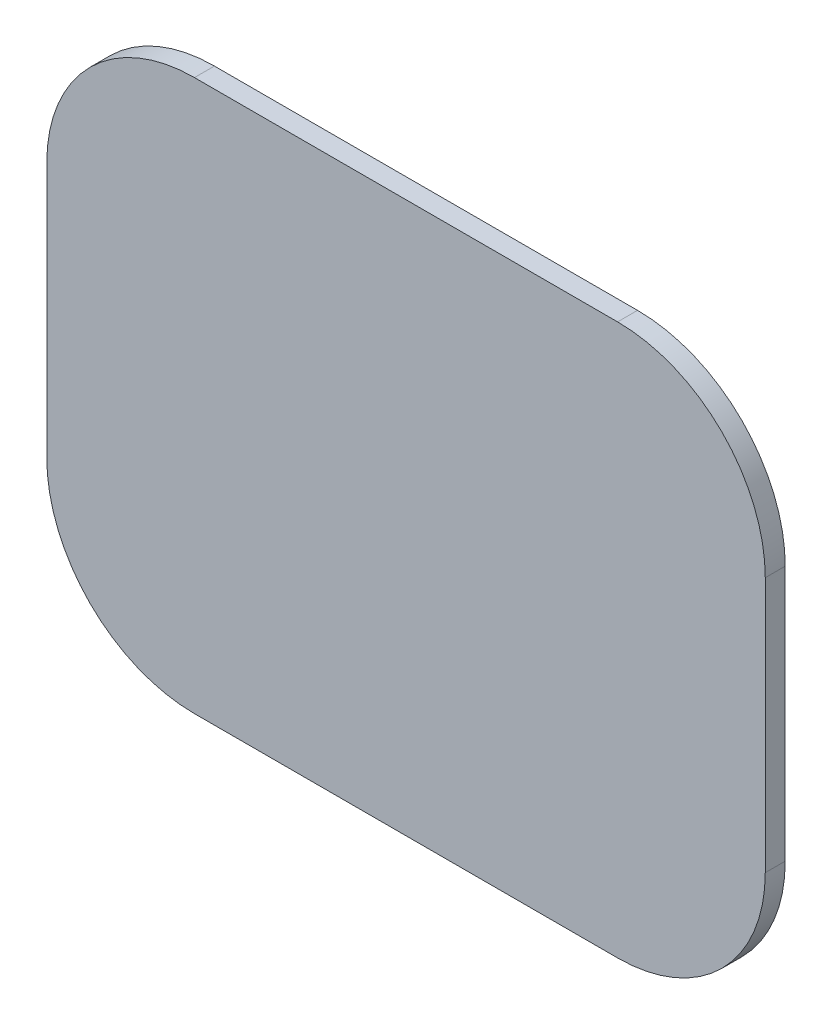
ISO-10303-21;
HEADER;
FILE_DESCRIPTION(('STEP AP214'),'2;1');
FILE_NAME('part.step','',(''),(''),'','','');
FILE_SCHEMA(('AUTOMOTIVE_DESIGN { 1 0 10303 214 1 1 1 1 }'));
ENDSEC;
DATA;
#1=APPLICATION_CONTEXT('core data for automotive mechanical design processes');
#2=APPLICATION_PROTOCOL_DEFINITION('international standard','automotive_design',2000,#1);
#3=PRODUCT_CONTEXT('',#1,'mechanical');
#4=PRODUCT('Part','Part','',(#3));
#5=PRODUCT_RELATED_PRODUCT_CATEGORY('part','',(#4));
#6=PRODUCT_DEFINITION_FORMATION('','',#4);
#7=PRODUCT_DEFINITION_CONTEXT('part definition',#1,'design');
#8=PRODUCT_DEFINITION('design','',#6,#7);
#9=PRODUCT_DEFINITION_SHAPE('','',#8);
#10=(LENGTH_UNIT() NAMED_UNIT(*) SI_UNIT(.MILLI.,.METRE.));
#11=(NAMED_UNIT(*) PLANE_ANGLE_UNIT() SI_UNIT($,.RADIAN.));
#12=(NAMED_UNIT(*) SI_UNIT($,.STERADIAN.) SOLID_ANGLE_UNIT());
#13=UNCERTAINTY_MEASURE_WITH_UNIT(LENGTH_MEASURE(1.E-05),#10,'distance_accuracy_value','');
#14=(GEOMETRIC_REPRESENTATION_CONTEXT(3) GLOBAL_UNCERTAINTY_ASSIGNED_CONTEXT((#13)) GLOBAL_UNIT_ASSIGNED_CONTEXT((#10,
#11,#12)) REPRESENTATION_CONTEXT('',''));
#15=CARTESIAN_POINT('',(0.,0.,0.));
#16=DIRECTION('',(0.,0.,1.));
#17=DIRECTION('',(1.,0.,0.));
#18=AXIS2_PLACEMENT_3D('',#15,#16,#17);
#19=CARTESIAN_POINT('',(144.480934022152,693.750628573082,9.50000000000003));
#20=DIRECTION('',(0.,0.,-1.));
#21=DIRECTION('',(-1.,0.,0.));
#22=AXIS2_PLACEMENT_3D('',#19,#20,#21);
#23=CYLINDRICAL_SURFACE('',#22,18.5);
#24=CARTESIAN_POINT('',(144.480934022152,693.750628573082,7.00000000000002));
#25=DIRECTION('',(0.,0.,1.));
#26=DIRECTION('',(1.,0.,0.));
#27=AXIS2_PLACEMENT_3D('',#24,#25,#26);
#28=CIRCLE('',#27,18.5);
#29=CARTESIAN_POINT('',(144.480934022153,712.250628573082,7.00000000000002));
#30=VERTEX_POINT('',#29);
#31=CARTESIAN_POINT('',(125.980934022152,693.750628573082,7.00000000000002));
#32=VERTEX_POINT('',#31);
#33=EDGE_CURVE('E129',#30,#32,#28,.T.);
#34=ORIENTED_EDGE('',*,*,#33,.T.);
#35=DIRECTION('',(0.,0.,-1.));
#36=VECTOR('',#35,1.);
#37=CARTESIAN_POINT('',(125.980934022152,693.750628573082,9.50000000000003));
#38=LINE('',#37,#36);
#39=CARTESIAN_POINT('',(125.980934022152,693.750628573082,9.50000000000003));
#40=VERTEX_POINT('',#39);
#41=EDGE_CURVE('E11',#40,#32,#38,.T.);
#42=ORIENTED_EDGE('',*,*,#41,.F.);
#43=CARTESIAN_POINT('',(144.480934022152,693.750628573082,9.50000000000003));
#44=DIRECTION('',(0.,0.,1.));
#45=DIRECTION('',(1.,0.,0.));
#46=AXIS2_PLACEMENT_3D('',#43,#44,#45);
#47=CIRCLE('',#46,18.5);
#48=CARTESIAN_POINT('',(144.480934022153,712.250628573082,9.50000000000003));
#49=VERTEX_POINT('',#48);
#50=EDGE_CURVE('E143',#49,#40,#47,.T.);
#51=ORIENTED_EDGE('',*,*,#50,.F.);
#52=DIRECTION('',(0.,0.,-1.));
#53=VECTOR('',#52,1.);
#54=CARTESIAN_POINT('',(144.480934022153,712.250628573082,9.50000000000003));
#55=LINE('',#54,#53);
#56=EDGE_CURVE('E125',#49,#30,#55,.T.);
#57=ORIENTED_EDGE('',*,*,#56,.T.);
#58=EDGE_LOOP('',(#34,#42,#51,#57));
#59=FACE_BOUND('',#58,.T.);
#60=ADVANCED_FACE('F33',(#59),#23,.T.);
#61=CARTESIAN_POINT('',(125.980934022152,693.750628573082,9.50000000000003));
#62=DIRECTION('',(1.,0.,0.));
#63=DIRECTION('',(0.,0.,-1.));
#64=AXIS2_PLACEMENT_3D('',#61,#62,#63);
#65=PLANE('',#64);
#66=DIRECTION('',(0.,-1.,0.));
#67=VECTOR('',#66,1.);
#68=CARTESIAN_POINT('',(125.980934022152,693.750628573082,7.00000000000002));
#69=LINE('',#68,#67);
#70=CARTESIAN_POINT('',(125.980934022152,661.750628573082,7.00000000000002));
#71=VERTEX_POINT('',#70);
#72=EDGE_CURVE('E132',#32,#71,#69,.T.);
#73=ORIENTED_EDGE('',*,*,#72,.T.);
#74=DIRECTION('',(0.,0.,-1.));
#75=VECTOR('',#74,1.);
#76=CARTESIAN_POINT('',(125.980934022152,661.750628573082,9.50000000000003));
#77=LINE('',#76,#75);
#78=CARTESIAN_POINT('',(125.980934022152,661.750628573082,9.50000000000003));
#79=VERTEX_POINT('',#78);
#80=EDGE_CURVE('E41',#79,#71,#77,.T.);
#81=ORIENTED_EDGE('',*,*,#80,.F.);
#82=DIRECTION('',(0.,-1.,0.));
#83=VECTOR('',#82,1.);
#84=CARTESIAN_POINT('',(125.980934022152,693.750628573082,9.50000000000003));
#85=LINE('',#84,#83);
#86=EDGE_CURVE('E92',#40,#79,#85,.T.);
#87=ORIENTED_EDGE('',*,*,#86,.F.);
#88=ORIENTED_EDGE('',*,*,#41,.T.);
#89=EDGE_LOOP('',(#73,#81,#87,#88));
#90=FACE_BOUND('',#89,.T.);
#91=ADVANCED_FACE('F178',(#90),#65,.F.);
#92=CARTESIAN_POINT('',(144.480934022152,661.750628573082,9.50000000000003));
#93=DIRECTION('',(0.,0.,-1.));
#94=DIRECTION('',(-1.,0.,0.));
#95=AXIS2_PLACEMENT_3D('',#92,#93,#94);
#96=CYLINDRICAL_SURFACE('',#95,18.5);
#97=CARTESIAN_POINT('',(144.480934022152,661.750628573082,7.00000000000002));
#98=DIRECTION('',(0.,0.,1.));
#99=DIRECTION('',(1.,0.,0.));
#100=AXIS2_PLACEMENT_3D('',#97,#98,#99);
#101=CIRCLE('',#100,18.5);
#102=CARTESIAN_POINT('',(144.480934022153,643.250628573082,7.00000000000002));
#103=VERTEX_POINT('',#102);
#104=EDGE_CURVE('E134',#71,#103,#101,.T.);
#105=ORIENTED_EDGE('',*,*,#104,.T.);
#106=DIRECTION('',(0.,0.,-1.));
#107=VECTOR('',#106,1.);
#108=CARTESIAN_POINT('',(144.480934022153,643.250628573082,9.50000000000003));
#109=LINE('',#108,#107);
#110=CARTESIAN_POINT('',(144.480934022153,643.250628573082,9.50000000000003));
#111=VERTEX_POINT('',#110);
#112=EDGE_CURVE('E150',#111,#103,#109,.T.);
#113=ORIENTED_EDGE('',*,*,#112,.F.);
#114=CARTESIAN_POINT('',(144.480934022152,661.750628573082,9.50000000000003));
#115=DIRECTION('',(0.,0.,1.));
#116=DIRECTION('',(1.,0.,0.));
#117=AXIS2_PLACEMENT_3D('',#114,#115,#116);
#118=CIRCLE('',#117,18.5);
#119=EDGE_CURVE('E158',#79,#111,#118,.T.);
#120=ORIENTED_EDGE('',*,*,#119,.F.);
#121=ORIENTED_EDGE('',*,*,#80,.T.);
#122=EDGE_LOOP('',(#105,#113,#120,#121));
#123=FACE_BOUND('',#122,.T.);
#124=ADVANCED_FACE('F156',(#123),#96,.T.);
#125=CARTESIAN_POINT('',(144.480934022153,643.250628573082,9.50000000000003));
#126=DIRECTION('',(0.,1.,0.));
#127=DIRECTION('',(0.,0.,1.));
#128=AXIS2_PLACEMENT_3D('',#125,#126,#127);
#129=PLANE('',#128);
#130=DIRECTION('',(1.,0.,0.));
#131=VECTOR('',#130,1.);
#132=CARTESIAN_POINT('',(144.480934022153,643.250628573082,7.00000000000002));
#133=LINE('',#132,#131);
#134=CARTESIAN_POINT('',(197.480934022152,643.250628573082,7.00000000000002));
#135=VERTEX_POINT('',#134);
#136=EDGE_CURVE('E136',#103,#135,#133,.T.);
#137=ORIENTED_EDGE('',*,*,#136,.T.);
#138=DIRECTION('',(0.,0.,-1.));
#139=VECTOR('',#138,1.);
#140=CARTESIAN_POINT('',(197.480934022152,643.250628573082,9.50000000000003));
#141=LINE('',#140,#139);
#142=CARTESIAN_POINT('',(197.480934022152,643.250628573082,9.50000000000003));
#143=VERTEX_POINT('',#142);
#144=EDGE_CURVE('E147',#143,#135,#141,.T.);
#145=ORIENTED_EDGE('',*,*,#144,.F.);
#146=DIRECTION('',(1.,0.,0.));
#147=VECTOR('',#146,1.);
#148=CARTESIAN_POINT('',(144.480934022153,643.250628573082,9.50000000000003));
#149=LINE('',#148,#147);
#150=EDGE_CURVE('E170',#111,#143,#149,.T.);
#151=ORIENTED_EDGE('',*,*,#150,.F.);
#152=ORIENTED_EDGE('',*,*,#112,.T.);
#153=EDGE_LOOP('',(#137,#145,#151,#152));
#154=FACE_BOUND('',#153,.T.);
#155=ADVANCED_FACE('F166',(#154),#129,.F.);
#156=CARTESIAN_POINT('',(197.480934022152,661.750628573082,9.50000000000003));
#157=DIRECTION('',(0.,0.,-1.));
#158=DIRECTION('',(-1.,0.,0.));
#159=AXIS2_PLACEMENT_3D('',#156,#157,#158);
#160=CYLINDRICAL_SURFACE('',#159,18.5);
#161=CARTESIAN_POINT('',(197.480934022152,661.750628573082,7.00000000000002));
#162=DIRECTION('',(0.,0.,1.));
#163=DIRECTION('',(1.,0.,0.));
#164=AXIS2_PLACEMENT_3D('',#161,#162,#163);
#165=CIRCLE('',#164,18.5);
#166=CARTESIAN_POINT('',(215.980934022152,661.750628573082,7.00000000000002));
#167=VERTEX_POINT('',#166);
#168=EDGE_CURVE('E138',#135,#167,#165,.T.);
#169=ORIENTED_EDGE('',*,*,#168,.T.);
#170=DIRECTION('',(0.,0.,-1.));
#171=VECTOR('',#170,1.);
#172=CARTESIAN_POINT('',(215.980934022152,661.750628573082,9.50000000000003));
#173=LINE('',#172,#171);
#174=CARTESIAN_POINT('',(215.980934022152,661.750628573082,9.50000000000003));
#175=VERTEX_POINT('',#174);
#176=EDGE_CURVE('E120',#175,#167,#173,.T.);
#177=ORIENTED_EDGE('',*,*,#176,.F.);
#178=CARTESIAN_POINT('',(197.480934022152,661.750628573082,9.50000000000003));
#179=DIRECTION('',(0.,0.,1.));
#180=DIRECTION('',(1.,0.,0.));
#181=AXIS2_PLACEMENT_3D('',#178,#179,#180);
#182=CIRCLE('',#181,18.5);
#183=EDGE_CURVE('E111',#143,#175,#182,.T.);
#184=ORIENTED_EDGE('',*,*,#183,.F.);
#185=ORIENTED_EDGE('',*,*,#144,.T.);
#186=EDGE_LOOP('',(#169,#177,#184,#185));
#187=FACE_BOUND('',#186,.T.);
#188=ADVANCED_FACE('F169',(#187),#160,.T.);
#189=CARTESIAN_POINT('',(215.980934022152,661.750628573082,9.50000000000003));
#190=DIRECTION('',(-1.,0.,0.));
#191=DIRECTION('',(0.,0.,1.));
#192=AXIS2_PLACEMENT_3D('',#189,#190,#191);
#193=PLANE('',#192);
#194=DIRECTION('',(0.,1.,0.));
#195=VECTOR('',#194,1.);
#196=CARTESIAN_POINT('',(215.980934022152,661.750628573082,7.00000000000002));
#197=LINE('',#196,#195);
#198=CARTESIAN_POINT('',(215.980934022152,693.750628573082,7.00000000000002));
#199=VERTEX_POINT('',#198);
#200=EDGE_CURVE('E119',#167,#199,#197,.T.);
#201=ORIENTED_EDGE('',*,*,#200,.T.);
#202=DIRECTION('',(0.,0.,-1.));
#203=VECTOR('',#202,1.);
#204=CARTESIAN_POINT('',(215.980934022152,693.750628573082,9.50000000000003));
#205=LINE('',#204,#203);
#206=CARTESIAN_POINT('',(215.980934022152,693.750628573082,9.50000000000003));
#207=VERTEX_POINT('',#206);
#208=EDGE_CURVE('E116',#207,#199,#205,.T.);
#209=ORIENTED_EDGE('',*,*,#208,.F.);
#210=DIRECTION('',(0.,1.,0.));
#211=VECTOR('',#210,1.);
#212=CARTESIAN_POINT('',(215.980934022152,661.750628573082,9.50000000000003));
#213=LINE('',#212,#211);
#214=EDGE_CURVE('E105',#175,#207,#213,.T.);
#215=ORIENTED_EDGE('',*,*,#214,.F.);
#216=ORIENTED_EDGE('',*,*,#176,.T.);
#217=EDGE_LOOP('',(#201,#209,#215,#216));
#218=FACE_BOUND('',#217,.T.);
#219=ADVANCED_FACE('F117',(#218),#193,.F.);
#220=CARTESIAN_POINT('',(197.480934022152,693.750628573082,9.50000000000003));
#221=DIRECTION('',(0.,0.,-1.));
#222=DIRECTION('',(-1.,0.,0.));
#223=AXIS2_PLACEMENT_3D('',#220,#221,#222);
#224=CYLINDRICAL_SURFACE('',#223,18.5);
#225=CARTESIAN_POINT('',(197.480934022152,693.750628573082,7.00000000000002));
#226=DIRECTION('',(0.,0.,1.));
#227=DIRECTION('',(1.,0.,0.));
#228=AXIS2_PLACEMENT_3D('',#225,#226,#227);
#229=CIRCLE('',#228,18.5);
#230=CARTESIAN_POINT('',(197.480934022152,712.250628573082,7.00000000000002));
#231=VERTEX_POINT('',#230);
#232=EDGE_CURVE('E78',#199,#231,#229,.T.);
#233=ORIENTED_EDGE('',*,*,#232,.T.);
#234=DIRECTION('',(0.,0.,-1.));
#235=VECTOR('',#234,1.);
#236=CARTESIAN_POINT('',(197.480934022152,712.250628573082,9.50000000000003));
#237=LINE('',#236,#235);
#238=CARTESIAN_POINT('',(197.480934022152,712.250628573082,9.50000000000003));
#239=VERTEX_POINT('',#238);
#240=EDGE_CURVE('E121',#239,#231,#237,.T.);
#241=ORIENTED_EDGE('',*,*,#240,.F.);
#242=CARTESIAN_POINT('',(197.480934022152,693.750628573082,9.50000000000003));
#243=DIRECTION('',(0.,0.,1.));
#244=DIRECTION('',(1.,0.,0.));
#245=AXIS2_PLACEMENT_3D('',#242,#243,#244);
#246=CIRCLE('',#245,18.5);
#247=EDGE_CURVE('E109',#207,#239,#246,.T.);
#248=ORIENTED_EDGE('',*,*,#247,.F.);
#249=ORIENTED_EDGE('',*,*,#208,.T.);
#250=EDGE_LOOP('',(#233,#241,#248,#249));
#251=FACE_BOUND('',#250,.T.);
#252=ADVANCED_FACE('F123',(#251),#224,.T.);
#253=CARTESIAN_POINT('',(197.480934022152,712.250628573082,9.50000000000003));
#254=DIRECTION('',(0.,-1.,0.));
#255=DIRECTION('',(0.,0.,-1.));
#256=AXIS2_PLACEMENT_3D('',#253,#254,#255);
#257=PLANE('',#256);
#258=DIRECTION('',(-1.,0.,0.));
#259=VECTOR('',#258,1.);
#260=CARTESIAN_POINT('',(197.480934022152,712.250628573082,7.00000000000002));
#261=LINE('',#260,#259);
#262=EDGE_CURVE('E84',#231,#30,#261,.T.);
#263=ORIENTED_EDGE('',*,*,#262,.T.);
#264=ORIENTED_EDGE('',*,*,#56,.F.);
#265=DIRECTION('',(-1.,0.,0.));
#266=VECTOR('',#265,1.);
#267=CARTESIAN_POINT('',(197.480934022152,712.250628573082,9.50000000000003));
#268=LINE('',#267,#266);
#269=EDGE_CURVE('E49',#239,#49,#268,.T.);
#270=ORIENTED_EDGE('',*,*,#269,.F.);
#271=ORIENTED_EDGE('',*,*,#240,.T.);
#272=EDGE_LOOP('',(#263,#264,#270,#271));
#273=FACE_BOUND('',#272,.T.);
#274=ADVANCED_FACE('F194',(#273),#257,.F.);
#275=CARTESIAN_POINT('',(144.480934022152,693.750628573082,9.50000000000003));
#276=DIRECTION('',(0.,0.,1.));
#277=DIRECTION('',(1.,0.,0.));
#278=AXIS2_PLACEMENT_3D('',#275,#276,#277);
#279=PLANE('',#278);
#280=ORIENTED_EDGE('',*,*,#50,.T.);
#281=ORIENTED_EDGE('',*,*,#86,.T.);
#282=ORIENTED_EDGE('',*,*,#119,.T.);
#283=ORIENTED_EDGE('',*,*,#150,.T.);
#284=ORIENTED_EDGE('',*,*,#183,.T.);
#285=ORIENTED_EDGE('',*,*,#214,.T.);
#286=ORIENTED_EDGE('',*,*,#247,.T.);
#287=ORIENTED_EDGE('',*,*,#269,.T.);
#288=EDGE_LOOP('',(#280,#281,#282,#283,#284,#285,#286,#287));
#289=FACE_BOUND('',#288,.T.);
#290=ADVANCED_FACE('F107',(#289),#279,.T.);
#291=CARTESIAN_POINT('',(144.480934022152,693.750628573082,7.00000000000002));
#292=DIRECTION('',(0.,0.,1.));
#293=DIRECTION('',(1.,0.,0.));
#294=AXIS2_PLACEMENT_3D('',#291,#292,#293);
#295=PLANE('',#294);
#296=ORIENTED_EDGE('',*,*,#33,.F.);
#297=ORIENTED_EDGE('',*,*,#262,.F.);
#298=ORIENTED_EDGE('',*,*,#232,.F.);
#299=ORIENTED_EDGE('',*,*,#200,.F.);
#300=ORIENTED_EDGE('',*,*,#168,.F.);
#301=ORIENTED_EDGE('',*,*,#136,.F.);
#302=ORIENTED_EDGE('',*,*,#104,.F.);
#303=ORIENTED_EDGE('',*,*,#72,.F.);
#304=EDGE_LOOP('',(#296,#297,#298,#299,#300,#301,#302,#303));
#305=FACE_BOUND('',#304,.T.);
#306=ADVANCED_FACE('F162',(#305),#295,.F.);
#307=CLOSED_SHELL('',(#60,#91,#124,#155,#188,#219,#252,#274,#290,#306));
#308=MANIFOLD_SOLID_BREP('B2',#307);
#309=ADVANCED_BREP_SHAPE_REPRESENTATION('',(#18,#308),#14);
#310=SHAPE_DEFINITION_REPRESENTATION(#9,#309);
ENDSEC;
END-ISO-10303-21;
